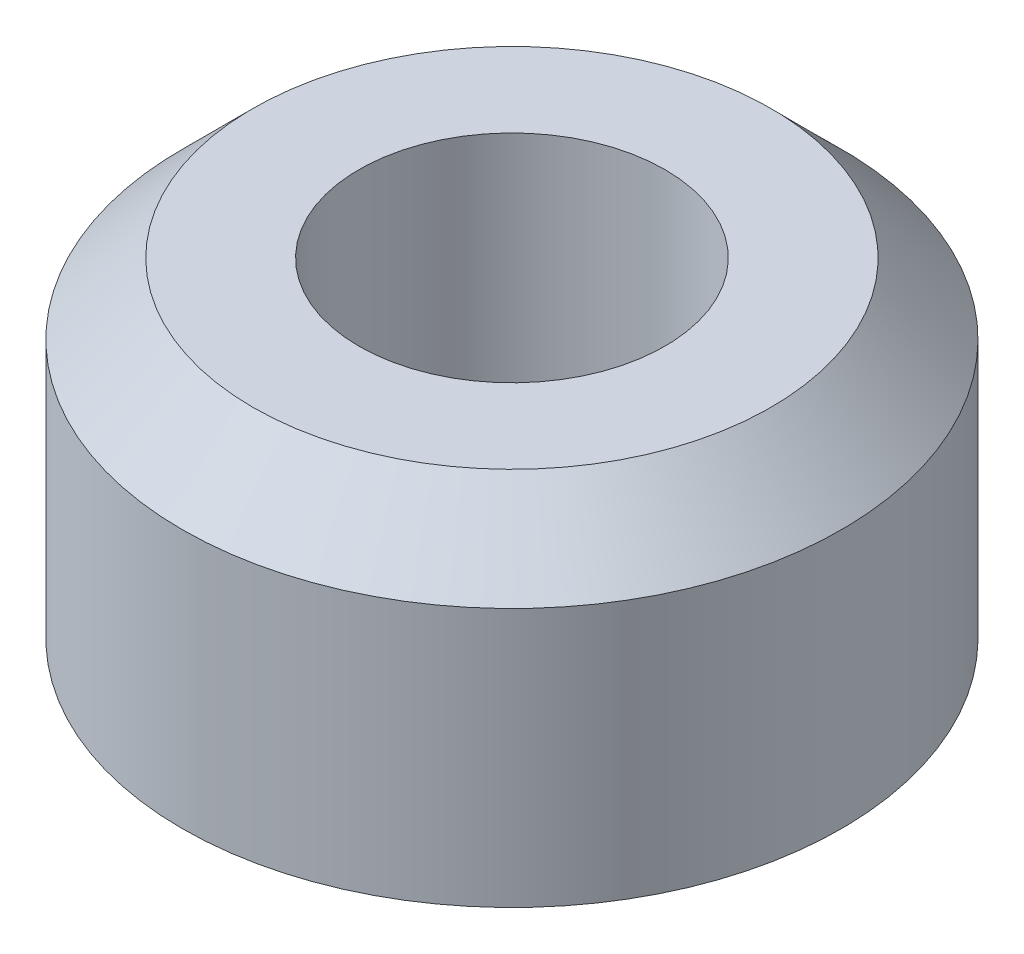
ISO-10303-21;
HEADER;
FILE_DESCRIPTION(('STEP AP214'),'2;1');
FILE_NAME('part.step','',(''),(''),'','','');
FILE_SCHEMA(('AUTOMOTIVE_DESIGN { 1 0 10303 214 1 1 1 1 }'));
ENDSEC;
DATA;
#1=APPLICATION_CONTEXT('core data for automotive mechanical design processes');
#2=APPLICATION_PROTOCOL_DEFINITION('international standard','automotive_design',2000,#1);
#3=PRODUCT_CONTEXT('',#1,'mechanical');
#4=PRODUCT('Part','Part','',(#3));
#5=PRODUCT_RELATED_PRODUCT_CATEGORY('part','',(#4));
#6=PRODUCT_DEFINITION_FORMATION('','',#4);
#7=PRODUCT_DEFINITION_CONTEXT('part definition',#1,'design');
#8=PRODUCT_DEFINITION('design','',#6,#7);
#9=PRODUCT_DEFINITION_SHAPE('','',#8);
#10=(LENGTH_UNIT() NAMED_UNIT(*) SI_UNIT(.MILLI.,.METRE.));
#11=(NAMED_UNIT(*) PLANE_ANGLE_UNIT() SI_UNIT($,.RADIAN.));
#12=(NAMED_UNIT(*) SI_UNIT($,.STERADIAN.) SOLID_ANGLE_UNIT());
#13=UNCERTAINTY_MEASURE_WITH_UNIT(LENGTH_MEASURE(1.E-05),#10,'distance_accuracy_value','');
#14=(GEOMETRIC_REPRESENTATION_CONTEXT(3) GLOBAL_UNCERTAINTY_ASSIGNED_CONTEXT((#13)) GLOBAL_UNIT_ASSIGNED_CONTEXT((#10,
#11,#12)) REPRESENTATION_CONTEXT('',''));
#15=CARTESIAN_POINT('',(0.,0.,0.));
#16=DIRECTION('',(0.,0.,1.));
#17=DIRECTION('',(1.,0.,0.));
#18=AXIS2_PLACEMENT_3D('',#15,#16,#17);
#19=CARTESIAN_POINT('',(0.,7.,0.));
#20=DIRECTION('',(0.,1.,0.));
#21=DIRECTION('',(0.,0.,1.));
#22=AXIS2_PLACEMENT_3D('',#19,#20,#21);
#23=PLANE('',#22);
#24=CARTESIAN_POINT('',(0.,7.,0.));
#25=DIRECTION('',(0.,1.,0.));
#26=DIRECTION('',(0.,0.,1.));
#27=AXIS2_PLACEMENT_3D('',#24,#25,#26);
#28=CIRCLE('',#27,5.5);
#29=CARTESIAN_POINT('',(0.,7.,5.5));
#30=VERTEX_POINT('',#29);
#31=EDGE_CURVE('E40',#30,#30,#28,.T.);
#32=ORIENTED_EDGE('',*,*,#31,.T.);
#33=EDGE_LOOP('',(#32));
#34=FACE_BOUND('',#33,.T.);
#35=CARTESIAN_POINT('',(0.,7.,0.));
#36=DIRECTION('',(0.,1.,0.));
#37=DIRECTION('',(0.,0.,1.));
#38=AXIS2_PLACEMENT_3D('',#35,#36,#37);
#39=CIRCLE('',#38,3.25);
#40=CARTESIAN_POINT('',(0.,7.,3.25));
#41=VERTEX_POINT('',#40);
#42=EDGE_CURVE('E48',#41,#41,#39,.T.);
#43=ORIENTED_EDGE('',*,*,#42,.F.);
#44=EDGE_LOOP('',(#43));
#45=FACE_BOUND('',#44,.T.);
#46=ADVANCED_FACE('F33',(#34,#45),#23,.T.);
#47=CARTESIAN_POINT('',(0.,0.,0.));
#48=DIRECTION('',(0.,1.,0.));
#49=DIRECTION('',(0.,0.,1.));
#50=AXIS2_PLACEMENT_3D('',#47,#48,#49);
#51=PLANE('',#50);
#52=CARTESIAN_POINT('',(0.,0.,0.));
#53=DIRECTION('',(0.,1.,0.));
#54=DIRECTION('',(0.,0.,1.));
#55=AXIS2_PLACEMENT_3D('',#52,#53,#54);
#56=CIRCLE('',#55,7.);
#57=CARTESIAN_POINT('',(0.,0.,7.));
#58=VERTEX_POINT('',#57);
#59=EDGE_CURVE('E44',#58,#58,#56,.T.);
#60=ORIENTED_EDGE('',*,*,#59,.F.);
#61=EDGE_LOOP('',(#60));
#62=FACE_BOUND('',#61,.T.);
#63=CARTESIAN_POINT('',(0.,0.,0.));
#64=DIRECTION('',(0.,1.,0.));
#65=DIRECTION('',(0.,0.,1.));
#66=AXIS2_PLACEMENT_3D('',#63,#64,#65);
#67=CIRCLE('',#66,3.25);
#68=CARTESIAN_POINT('',(0.,0.,3.25));
#69=VERTEX_POINT('',#68);
#70=EDGE_CURVE('E51',#69,#69,#67,.T.);
#71=ORIENTED_EDGE('',*,*,#70,.T.);
#72=EDGE_LOOP('',(#71));
#73=FACE_BOUND('',#72,.T.);
#74=ADVANCED_FACE('F61',(#62,#73),#51,.F.);
#75=CARTESIAN_POINT('',(0.,7.,0.));
#76=DIRECTION('',(0.,-1.,0.));
#77=DIRECTION('',(0.,0.,-1.));
#78=AXIS2_PLACEMENT_3D('',#75,#76,#77);
#79=CYLINDRICAL_SURFACE('',#78,7.);
#80=CARTESIAN_POINT('',(0.,5.49999999999999,0.));
#81=DIRECTION('',(0.,1.,0.));
#82=DIRECTION('',(0.,0.,1.));
#83=AXIS2_PLACEMENT_3D('',#80,#81,#82);
#84=CIRCLE('',#83,7.);
#85=CARTESIAN_POINT('',(0.,5.49999999999999,7.));
#86=VERTEX_POINT('',#85);
#87=EDGE_CURVE('E10',#86,#86,#84,.F.);
#88=ORIENTED_EDGE('',*,*,#87,.T.);
#89=EDGE_LOOP('',(#88));
#90=FACE_BOUND('',#89,.T.);
#91=ORIENTED_EDGE('',*,*,#59,.T.);
#92=EDGE_LOOP('',(#91));
#93=FACE_BOUND('',#92,.T.);
#94=ADVANCED_FACE('F66',(#90,#93),#79,.T.);
#95=CARTESIAN_POINT('',(0.,7.,0.));
#96=DIRECTION('',(0.,-1.,0.));
#97=DIRECTION('',(0.,0.,-1.));
#98=AXIS2_PLACEMENT_3D('',#95,#96,#97);
#99=CYLINDRICAL_SURFACE('',#98,3.25);
#100=ORIENTED_EDGE('',*,*,#42,.T.);
#101=EDGE_LOOP('',(#100));
#102=FACE_BOUND('',#101,.T.);
#103=ORIENTED_EDGE('',*,*,#70,.F.);
#104=EDGE_LOOP('',(#103));
#105=FACE_BOUND('',#104,.T.);
#106=ADVANCED_FACE('F57',(#102,#105),#99,.F.);
#107=CARTESIAN_POINT('',(0.,7.,0.));
#108=DIRECTION('',(0.,-1.,0.));
#109=DIRECTION('',(0.,0.,-1.));
#110=AXIS2_PLACEMENT_3D('',#107,#108,#109);
#111=CONICAL_SURFACE('',#110,5.5,0.785398163397446);
#112=ORIENTED_EDGE('',*,*,#87,.F.);
#113=EDGE_LOOP('',(#112));
#114=FACE_BOUND('',#113,.T.);
#115=ORIENTED_EDGE('',*,*,#31,.F.);
#116=EDGE_LOOP('',(#115));
#117=FACE_BOUND('',#116,.T.);
#118=ADVANCED_FACE('F35',(#114,#117),#111,.T.);
#119=CLOSED_SHELL('',(#46,#74,#94,#106,#118));
#120=MANIFOLD_SOLID_BREP('B2',#119);
#121=ADVANCED_BREP_SHAPE_REPRESENTATION('',(#18,#120),#14);
#122=SHAPE_DEFINITION_REPRESENTATION(#9,#121);
ENDSEC;
END-ISO-10303-21;
